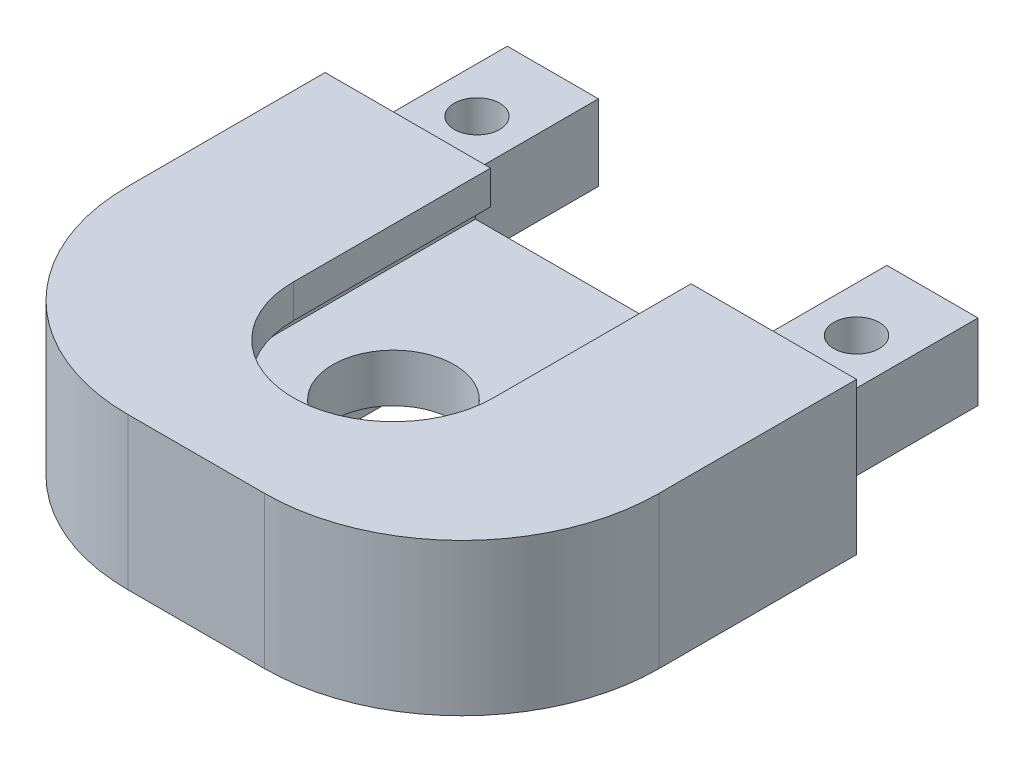
ISO-10303-21;
HEADER;
FILE_DESCRIPTION(('STEP AP214'),'2;1');
FILE_NAME('part.step','',(''),(''),'','','');
FILE_SCHEMA(('AUTOMOTIVE_DESIGN { 1 0 10303 214 1 1 1 1 }'));
ENDSEC;
DATA;
#1=APPLICATION_CONTEXT('core data for automotive mechanical design processes');
#2=APPLICATION_PROTOCOL_DEFINITION('international standard','automotive_design',2000,#1);
#3=PRODUCT_CONTEXT('',#1,'mechanical');
#4=PRODUCT('Part','Part','',(#3));
#5=PRODUCT_RELATED_PRODUCT_CATEGORY('part','',(#4));
#6=PRODUCT_DEFINITION_FORMATION('','',#4);
#7=PRODUCT_DEFINITION_CONTEXT('part definition',#1,'design');
#8=PRODUCT_DEFINITION('design','',#6,#7);
#9=PRODUCT_DEFINITION_SHAPE('','',#8);
#10=(LENGTH_UNIT() NAMED_UNIT(*) SI_UNIT(.MILLI.,.METRE.));
#11=(NAMED_UNIT(*) PLANE_ANGLE_UNIT() SI_UNIT($,.RADIAN.));
#12=(NAMED_UNIT(*) SI_UNIT($,.STERADIAN.) SOLID_ANGLE_UNIT());
#13=UNCERTAINTY_MEASURE_WITH_UNIT(LENGTH_MEASURE(1.E-05),#10,'distance_accuracy_value','');
#14=(GEOMETRIC_REPRESENTATION_CONTEXT(3) GLOBAL_UNCERTAINTY_ASSIGNED_CONTEXT((#13)) GLOBAL_UNIT_ASSIGNED_CONTEXT((#10,
#11,#12)) REPRESENTATION_CONTEXT('',''));
#15=CARTESIAN_POINT('',(0.,0.,0.));
#16=DIRECTION('',(0.,0.,1.));
#17=DIRECTION('',(1.,0.,0.));
#18=AXIS2_PLACEMENT_3D('',#15,#16,#17);
#19=CARTESIAN_POINT('',(6.,5.,10.));
#20=DIRECTION('',(0.,0.,1.));
#21=DIRECTION('',(1.,0.,0.));
#22=AXIS2_PLACEMENT_3D('',#19,#20,#21);
#23=PLANE('',#22);
#24=DIRECTION('',(0.,-1.,0.));
#25=VECTOR('',#24,1.);
#26=CARTESIAN_POINT('',(25.,5.,10.));
#27=LINE('',#26,#25);
#28=CARTESIAN_POINT('',(25.,5.,10.));
#29=VERTEX_POINT('',#28);
#30=CARTESIAN_POINT('',(25.,0.,10.));
#31=VERTEX_POINT('',#30);
#32=EDGE_CURVE('E425',#29,#31,#27,.T.);
#33=ORIENTED_EDGE('',*,*,#32,.T.);
#34=DIRECTION('',(1.,0.,0.));
#35=VECTOR('',#34,1.);
#36=CARTESIAN_POINT('',(-2.,0.,10.));
#37=LINE('',#36,#35);
#38=CARTESIAN_POINT('',(31.,0.,10.));
#39=VERTEX_POINT('',#38);
#40=EDGE_CURVE('E352',#31,#39,#37,.T.);
#41=ORIENTED_EDGE('',*,*,#40,.T.);
#42=DIRECTION('',(0.,-1.,0.));
#43=VECTOR('',#42,1.);
#44=CARTESIAN_POINT('',(31.,5.,10.));
#45=LINE('',#44,#43);
#46=CARTESIAN_POINT('',(31.,5.,10.));
#47=VERTEX_POINT('',#46);
#48=EDGE_CURVE('E434',#47,#39,#45,.T.);
#49=ORIENTED_EDGE('',*,*,#48,.F.);
#50=DIRECTION('',(-1.,0.,0.));
#51=VECTOR('',#50,1.);
#52=CARTESIAN_POINT('',(33.,5.,10.));
#53=LINE('',#52,#51);
#54=EDGE_CURVE('E369',#47,#29,#53,.T.);
#55=ORIENTED_EDGE('',*,*,#54,.T.);
#56=EDGE_LOOP('',(#33,#41,#49,#55));
#57=FACE_BOUND('',#56,.T.);
#58=CARTESIAN_POINT('',(0.,0.,10.));
#59=VERTEX_POINT('',#58);
#60=CARTESIAN_POINT('',(6.,0.,10.));
#61=VERTEX_POINT('',#60);
#62=EDGE_CURVE('E349',#59,#61,#37,.T.);
#63=ORIENTED_EDGE('',*,*,#62,.T.);
#64=DIRECTION('',(0.,-1.,0.));
#65=VECTOR('',#64,1.);
#66=CARTESIAN_POINT('',(6.,5.,10.));
#67=LINE('',#66,#65);
#68=CARTESIAN_POINT('',(6.,5.,10.));
#69=VERTEX_POINT('',#68);
#70=EDGE_CURVE('E422',#69,#61,#67,.T.);
#71=ORIENTED_EDGE('',*,*,#70,.F.);
#72=CARTESIAN_POINT('',(0.,5.,10.));
#73=VERTEX_POINT('',#72);
#74=EDGE_CURVE('E372',#69,#73,#53,.T.);
#75=ORIENTED_EDGE('',*,*,#74,.T.);
#76=DIRECTION('',(0.,-1.,0.));
#77=VECTOR('',#76,1.);
#78=CARTESIAN_POINT('',(0.,5.,10.));
#79=LINE('',#78,#77);
#80=EDGE_CURVE('E442',#73,#59,#79,.T.);
#81=ORIENTED_EDGE('',*,*,#80,.T.);
#82=EDGE_LOOP('',(#63,#71,#75,#81));
#83=FACE_BOUND('',#82,.T.);
#84=DIRECTION('',(1.,0.,0.));
#85=VECTOR('',#84,1.);
#86=CARTESIAN_POINT('',(6.,-0.287500000000004,10.));
#87=LINE('',#86,#85);
#88=CARTESIAN_POINT('',(7.9,-0.287500000000004,10.));
#89=VERTEX_POINT('',#88);
#90=CARTESIAN_POINT('',(8.9,-0.287500000000004,10.));
#91=VERTEX_POINT('',#90);
#92=EDGE_CURVE('E11',#89,#91,#87,.T.);
#93=ORIENTED_EDGE('',*,*,#92,.T.);
#94=DIRECTION('',(0.,-1.,0.));
#95=VECTOR('',#94,1.);
#96=CARTESIAN_POINT('',(8.9,5.,10.));
#97=LINE('',#96,#95);
#98=CARTESIAN_POINT('',(8.9,-2.5,10.));
#99=VERTEX_POINT('',#98);
#100=EDGE_CURVE('E305',#91,#99,#97,.T.);
#101=ORIENTED_EDGE('',*,*,#100,.T.);
#102=DIRECTION('',(-1.,0.,0.));
#103=VECTOR('',#102,1.);
#104=CARTESIAN_POINT('',(33.,-2.5,10.));
#105=LINE('',#104,#103);
#106=CARTESIAN_POINT('',(-2.,-2.5,10.));
#107=VERTEX_POINT('',#106);
#108=EDGE_CURVE('E359',#99,#107,#105,.T.);
#109=ORIENTED_EDGE('',*,*,#108,.T.);
#110=DIRECTION('',(0.,-1.,0.));
#111=VECTOR('',#110,1.);
#112=CARTESIAN_POINT('',(-2.,5.,10.));
#113=LINE('',#112,#111);
#114=CARTESIAN_POINT('',(-2.,7.5,10.));
#115=VERTEX_POINT('',#114);
#116=EDGE_CURVE('E439',#115,#107,#113,.T.);
#117=ORIENTED_EDGE('',*,*,#116,.F.);
#118=DIRECTION('',(1.,0.,0.));
#119=VECTOR('',#118,1.);
#120=CARTESIAN_POINT('',(-2.,7.5,10.));
#121=LINE('',#120,#119);
#122=CARTESIAN_POINT('',(8.9,7.5,10.));
#123=VERTEX_POINT('',#122);
#124=EDGE_CURVE('E364',#115,#123,#121,.T.);
#125=ORIENTED_EDGE('',*,*,#124,.T.);
#126=DIRECTION('',(0.,1.,0.));
#127=VECTOR('',#126,1.);
#128=CARTESIAN_POINT('',(8.9,5.,10.));
#129=LINE('',#128,#127);
#130=CARTESIAN_POINT('',(8.9,5.2875,10.));
#131=VERTEX_POINT('',#130);
#132=EDGE_CURVE('E344',#131,#123,#129,.T.);
#133=ORIENTED_EDGE('',*,*,#132,.F.);
#134=DIRECTION('',(1.,0.,0.));
#135=VECTOR('',#134,1.);
#136=CARTESIAN_POINT('',(6.,5.2875,10.));
#137=LINE('',#136,#135);
#138=CARTESIAN_POINT('',(7.9,5.2875,10.));
#139=VERTEX_POINT('',#138);
#140=EDGE_CURVE('E466',#139,#131,#137,.T.);
#141=ORIENTED_EDGE('',*,*,#140,.F.);
#142=DIRECTION('',(0.,1.,0.));
#143=VECTOR('',#142,1.);
#144=CARTESIAN_POINT('',(7.9,5.,10.));
#145=LINE('',#144,#143);
#146=CARTESIAN_POINT('',(7.9,4.0875,10.));
#147=VERTEX_POINT('',#146);
#148=EDGE_CURVE('E468',#147,#139,#145,.T.);
#149=ORIENTED_EDGE('',*,*,#148,.F.);
#150=DIRECTION('',(-1.,0.,0.));
#151=VECTOR('',#150,1.);
#152=CARTESIAN_POINT('',(6.,4.0875,10.));
#153=LINE('',#152,#151);
#154=CARTESIAN_POINT('',(23.1,4.0875,10.));
#155=VERTEX_POINT('',#154);
#156=EDGE_CURVE('E470',#155,#147,#153,.T.);
#157=ORIENTED_EDGE('',*,*,#156,.F.);
#158=DIRECTION('',(0.,-1.,0.));
#159=VECTOR('',#158,1.);
#160=CARTESIAN_POINT('',(23.1,5.,10.));
#161=LINE('',#160,#159);
#162=CARTESIAN_POINT('',(23.1,5.2875,10.));
#163=VERTEX_POINT('',#162);
#164=EDGE_CURVE('E264',#163,#155,#161,.T.);
#165=ORIENTED_EDGE('',*,*,#164,.F.);
#166=DIRECTION('',(1.,0.,0.));
#167=VECTOR('',#166,1.);
#168=CARTESIAN_POINT('',(6.,5.28749999999994,10.));
#169=LINE('',#168,#167);
#170=CARTESIAN_POINT('',(22.1,5.2875,10.));
#171=VERTEX_POINT('',#170);
#172=EDGE_CURVE('E260',#171,#163,#169,.T.);
#173=ORIENTED_EDGE('',*,*,#172,.F.);
#174=DIRECTION('',(0.,-1.,0.));
#175=VECTOR('',#174,1.);
#176=CARTESIAN_POINT('',(22.1,5.,10.));
#177=LINE('',#176,#175);
#178=CARTESIAN_POINT('',(22.1,7.5,10.));
#179=VERTEX_POINT('',#178);
#180=EDGE_CURVE('E346',#179,#171,#177,.T.);
#181=ORIENTED_EDGE('',*,*,#180,.F.);
#182=CARTESIAN_POINT('',(33.,7.5,10.));
#183=VERTEX_POINT('',#182);
#184=EDGE_CURVE('E368',#179,#183,#121,.T.);
#185=ORIENTED_EDGE('',*,*,#184,.T.);
#186=DIRECTION('',(0.,-1.,0.));
#187=VECTOR('',#186,1.);
#188=CARTESIAN_POINT('',(33.,5.,10.));
#189=LINE('',#188,#187);
#190=CARTESIAN_POINT('',(33.,-2.5,10.));
#191=VERTEX_POINT('',#190);
#192=EDGE_CURVE('E437',#183,#191,#189,.T.);
#193=ORIENTED_EDGE('',*,*,#192,.T.);
#194=CARTESIAN_POINT('',(22.1,-2.5,10.));
#195=VERTEX_POINT('',#194);
#196=EDGE_CURVE('E361',#191,#195,#105,.T.);
#197=ORIENTED_EDGE('',*,*,#196,.T.);
#198=DIRECTION('',(0.,1.,0.));
#199=VECTOR('',#198,1.);
#200=CARTESIAN_POINT('',(22.1,5.,10.));
#201=LINE('',#200,#199);
#202=CARTESIAN_POINT('',(22.1,-0.2875,10.));
#203=VERTEX_POINT('',#202);
#204=EDGE_CURVE('E259',#195,#203,#201,.T.);
#205=ORIENTED_EDGE('',*,*,#204,.T.);
#206=DIRECTION('',(1.,0.,0.));
#207=VECTOR('',#206,1.);
#208=CARTESIAN_POINT('',(5.99999999999998,-0.287499999999945,10.));
#209=LINE('',#208,#207);
#210=CARTESIAN_POINT('',(23.1,-0.287500000000004,10.));
#211=VERTEX_POINT('',#210);
#212=EDGE_CURVE('E262',#203,#211,#209,.T.);
#213=ORIENTED_EDGE('',*,*,#212,.T.);
#214=DIRECTION('',(0.,1.,0.));
#215=VECTOR('',#214,1.);
#216=CARTESIAN_POINT('',(23.1,5.,10.));
#217=LINE('',#216,#215);
#218=CARTESIAN_POINT('',(23.1,0.912499999999999,10.));
#219=VERTEX_POINT('',#218);
#220=EDGE_CURVE('E270',#211,#219,#217,.T.);
#221=ORIENTED_EDGE('',*,*,#220,.T.);
#222=DIRECTION('',(-1.,0.,0.));
#223=VECTOR('',#222,1.);
#224=CARTESIAN_POINT('',(6.,0.912499999999999,10.));
#225=LINE('',#224,#223);
#226=CARTESIAN_POINT('',(7.9,0.912499999999999,10.));
#227=VERTEX_POINT('',#226);
#228=EDGE_CURVE('E273',#219,#227,#225,.T.);
#229=ORIENTED_EDGE('',*,*,#228,.T.);
#230=DIRECTION('',(0.,-1.,0.));
#231=VECTOR('',#230,1.);
#232=CARTESIAN_POINT('',(7.9,5.,10.));
#233=LINE('',#232,#231);
#234=EDGE_CURVE('E42',#227,#89,#233,.T.);
#235=ORIENTED_EDGE('',*,*,#234,.T.);
#236=EDGE_LOOP('',(#93,#101,#109,#117,#125,#133,#141,#149,#157,#165,#173,#181,#185,#193,#197,
#205,#213,#221,#229,#235));
#237=FACE_BOUND('',#236,.T.);
#238=ADVANCED_FACE('F33',(#57,#83,#237),#23,.F.);
#239=CARTESIAN_POINT('',(-2.,7.5,-25.0891721190455));
#240=DIRECTION('',(0.,1.,0.));
#241=DIRECTION('',(0.,0.,1.));
#242=AXIS2_PLACEMENT_3D('',#239,#240,#241);
#243=PLANE('',#242);
#244=DIRECTION('',(0.,0.,1.));
#245=VECTOR('',#244,1.);
#246=CARTESIAN_POINT('',(22.1,7.5,-25.0891721190455));
#247=LINE('',#246,#245);
#248=CARTESIAN_POINT('',(22.1,7.5,23.));
#249=VERTEX_POINT('',#248);
#250=EDGE_CURVE('E463',#179,#249,#247,.T.);
#251=ORIENTED_EDGE('',*,*,#250,.T.);
#252=CARTESIAN_POINT('',(15.5,7.5,23.));
#253=DIRECTION('',(0.,1.,0.));
#254=DIRECTION('',(0.,0.,1.));
#255=AXIS2_PLACEMENT_3D('',#252,#253,#254);
#256=CIRCLE('',#255,6.6);
#257=CARTESIAN_POINT('',(8.9,7.5,23.));
#258=VERTEX_POINT('',#257);
#259=EDGE_CURVE('E307',#258,#249,#256,.T.);
#260=ORIENTED_EDGE('',*,*,#259,.F.);
#261=DIRECTION('',(0.,0.,-1.));
#262=VECTOR('',#261,1.);
#263=CARTESIAN_POINT('',(8.9,7.5,-25.0891721190455));
#264=LINE('',#263,#262);
#265=EDGE_CURVE('E460',#258,#123,#264,.T.);
#266=ORIENTED_EDGE('',*,*,#265,.T.);
#267=ORIENTED_EDGE('',*,*,#124,.F.);
#268=DIRECTION('',(0.,0.,1.));
#269=VECTOR('',#268,1.);
#270=CARTESIAN_POINT('',(-2.,7.5,-25.0891721190455));
#271=LINE('',#270,#269);
#272=CARTESIAN_POINT('',(-2.,7.5,23.));
#273=VERTEX_POINT('',#272);
#274=EDGE_CURVE('E375',#115,#273,#271,.T.);
#275=ORIENTED_EDGE('',*,*,#274,.T.);
#276=CARTESIAN_POINT('',(11.,7.5,23.));
#277=DIRECTION('',(0.,1.,0.));
#278=DIRECTION('',(0.,0.,1.));
#279=AXIS2_PLACEMENT_3D('',#276,#277,#278);
#280=CIRCLE('',#279,13.);
#281=CARTESIAN_POINT('',(11.,7.5,36.));
#282=VERTEX_POINT('',#281);
#283=EDGE_CURVE('E56',#273,#282,#280,.T.);
#284=ORIENTED_EDGE('',*,*,#283,.T.);
#285=DIRECTION('',(-1.,0.,0.));
#286=VECTOR('',#285,1.);
#287=CARTESIAN_POINT('',(-2.,7.5,36.));
#288=LINE('',#287,#286);
#289=CARTESIAN_POINT('',(20.,7.5,36.));
#290=VERTEX_POINT('',#289);
#291=EDGE_CURVE('E363',#290,#282,#288,.T.);
#292=ORIENTED_EDGE('',*,*,#291,.F.);
#293=CARTESIAN_POINT('',(20.,7.5,23.));
#294=DIRECTION('',(0.,1.,0.));
#295=DIRECTION('',(0.,0.,1.));
#296=AXIS2_PLACEMENT_3D('',#293,#294,#295);
#297=CIRCLE('',#296,13.);
#298=CARTESIAN_POINT('',(33.,7.5,23.));
#299=VERTEX_POINT('',#298);
#300=EDGE_CURVE('E457',#290,#299,#297,.T.);
#301=ORIENTED_EDGE('',*,*,#300,.T.);
#302=DIRECTION('',(0.,0.,1.));
#303=VECTOR('',#302,1.);
#304=CARTESIAN_POINT('',(33.,7.5,-25.0891721190455));
#305=LINE('',#304,#303);
#306=EDGE_CURVE('E374',#183,#299,#305,.T.);
#307=ORIENTED_EDGE('',*,*,#306,.F.);
#308=ORIENTED_EDGE('',*,*,#184,.F.);
#309=EDGE_LOOP('',(#251,#260,#266,#267,#275,#284,#292,#301,#307,#308));
#310=FACE_BOUND('',#309,.T.);
#311=ADVANCED_FACE('F509',(#310),#243,.T.);
#312=CARTESIAN_POINT('',(0.,0.,0.));
#313=DIRECTION('',(0.,-1.,0.));
#314=DIRECTION('',(0.,0.,-1.));
#315=AXIS2_PLACEMENT_3D('',#312,#313,#314);
#316=PLANE('',#315);
#317=ORIENTED_EDGE('',*,*,#62,.F.);
#318=DIRECTION('',(0.,0.,1.));
#319=VECTOR('',#318,1.);
#320=CARTESIAN_POINT('',(0.,0.,10.));
#321=LINE('',#320,#319);
#322=CARTESIAN_POINT('',(0.,0.,0.));
#323=VERTEX_POINT('',#322);
#324=EDGE_CURVE('E388',#323,#59,#321,.T.);
#325=ORIENTED_EDGE('',*,*,#324,.F.);
#326=DIRECTION('',(-1.,0.,0.));
#327=VECTOR('',#326,1.);
#328=CARTESIAN_POINT('',(0.,0.,0.));
#329=LINE('',#328,#327);
#330=CARTESIAN_POINT('',(6.,0.,0.));
#331=VERTEX_POINT('',#330);
#332=EDGE_CURVE('E394',#331,#323,#329,.T.);
#333=ORIENTED_EDGE('',*,*,#332,.F.);
#334=DIRECTION('',(0.,0.,-1.));
#335=VECTOR('',#334,1.);
#336=CARTESIAN_POINT('',(6.,0.,0.));
#337=LINE('',#336,#335);
#338=EDGE_CURVE('E414',#61,#331,#337,.T.);
#339=ORIENTED_EDGE('',*,*,#338,.F.);
#340=EDGE_LOOP('',(#317,#325,#333,#339));
#341=FACE_BOUND('',#340,.T.);
#342=CARTESIAN_POINT('',(3.,0.,5.));
#343=DIRECTION('',(0.,1.,0.));
#344=DIRECTION('',(0.,0.,1.));
#345=AXIS2_PLACEMENT_3D('',#342,#343,#344);
#346=CIRCLE('',#345,1.5);
#347=CARTESIAN_POINT('',(3.,0.,6.5));
#348=VERTEX_POINT('',#347);
#349=EDGE_CURVE('E382',#348,#348,#346,.T.);
#350=ORIENTED_EDGE('',*,*,#349,.T.);
#351=EDGE_LOOP('',(#350));
#352=FACE_BOUND('',#351,.T.);
#353=ADVANCED_FACE('F515',(#341,#352),#316,.T.);
#354=CARTESIAN_POINT('',(0.,5.,0.));
#355=DIRECTION('',(0.,-1.,0.));
#356=DIRECTION('',(0.,0.,-1.));
#357=AXIS2_PLACEMENT_3D('',#354,#355,#356);
#358=PLANE('',#357);
#359=CARTESIAN_POINT('',(28.,5.,5.));
#360=DIRECTION('',(0.,1.,0.));
#361=DIRECTION('',(0.,0.,-1.));
#362=AXIS2_PLACEMENT_3D('',#359,#360,#361);
#363=CIRCLE('',#362,1.5);
#364=CARTESIAN_POINT('',(28.,5.,3.5));
#365=VERTEX_POINT('',#364);
#366=EDGE_CURVE('E379',#365,#365,#363,.T.);
#367=ORIENTED_EDGE('',*,*,#366,.F.);
#368=EDGE_LOOP('',(#367));
#369=FACE_BOUND('',#368,.T.);
#370=ORIENTED_EDGE('',*,*,#54,.F.);
#371=DIRECTION('',(0.,0.,-1.));
#372=VECTOR('',#371,1.);
#373=CARTESIAN_POINT('',(31.,5.,0.));
#374=LINE('',#373,#372);
#375=CARTESIAN_POINT('',(31.,5.,0.));
#376=VERTEX_POINT('',#375);
#377=EDGE_CURVE('E393',#47,#376,#374,.T.);
#378=ORIENTED_EDGE('',*,*,#377,.T.);
#379=DIRECTION('',(-1.,0.,0.));
#380=VECTOR('',#379,1.);
#381=CARTESIAN_POINT('',(25.,5.,0.));
#382=LINE('',#381,#380);
#383=CARTESIAN_POINT('',(25.,5.,0.));
#384=VERTEX_POINT('',#383);
#385=EDGE_CURVE('E396',#376,#384,#382,.T.);
#386=ORIENTED_EDGE('',*,*,#385,.T.);
#387=DIRECTION('',(0.,0.,1.));
#388=VECTOR('',#387,1.);
#389=CARTESIAN_POINT('',(25.,5.,10.));
#390=LINE('',#389,#388);
#391=EDGE_CURVE('E398',#384,#29,#390,.T.);
#392=ORIENTED_EDGE('',*,*,#391,.T.);
#393=EDGE_LOOP('',(#370,#378,#386,#392));
#394=FACE_BOUND('',#393,.T.);
#395=ADVANCED_FACE('F759',(#369,#394),#358,.F.);
#396=CARTESIAN_POINT('',(3.,5.,5.));
#397=DIRECTION('',(0.,1.,0.));
#398=DIRECTION('',(0.,0.,1.));
#399=AXIS2_PLACEMENT_3D('',#396,#397,#398);
#400=CIRCLE('',#399,1.5);
#401=CARTESIAN_POINT('',(3.,5.,6.5));
#402=VERTEX_POINT('',#401);
#403=EDGE_CURVE('E385',#402,#402,#400,.T.);
#404=ORIENTED_EDGE('',*,*,#403,.F.);
#405=EDGE_LOOP('',(#404));
#406=FACE_BOUND('',#405,.T.);
#407=ORIENTED_EDGE('',*,*,#74,.F.);
#408=DIRECTION('',(0.,0.,-1.));
#409=VECTOR('',#408,1.);
#410=CARTESIAN_POINT('',(6.,5.,0.));
#411=LINE('',#410,#409);
#412=CARTESIAN_POINT('',(6.,5.,0.));
#413=VERTEX_POINT('',#412);
#414=EDGE_CURVE('E400',#69,#413,#411,.T.);
#415=ORIENTED_EDGE('',*,*,#414,.T.);
#416=DIRECTION('',(-1.,0.,0.));
#417=VECTOR('',#416,1.);
#418=CARTESIAN_POINT('',(0.,5.,0.));
#419=LINE('',#418,#417);
#420=CARTESIAN_POINT('',(0.,5.,0.));
#421=VERTEX_POINT('',#420);
#422=EDGE_CURVE('E402',#413,#421,#419,.T.);
#423=ORIENTED_EDGE('',*,*,#422,.T.);
#424=DIRECTION('',(0.,0.,1.));
#425=VECTOR('',#424,1.);
#426=CARTESIAN_POINT('',(0.,5.,10.));
#427=LINE('',#426,#425);
#428=EDGE_CURVE('E391',#421,#73,#427,.T.);
#429=ORIENTED_EDGE('',*,*,#428,.T.);
#430=EDGE_LOOP('',(#407,#415,#423,#429));
#431=FACE_BOUND('',#430,.T.);
#432=ADVANCED_FACE('F768',(#406,#431),#358,.F.);
#433=ORIENTED_EDGE('',*,*,#40,.F.);
#434=DIRECTION('',(0.,0.,1.));
#435=VECTOR('',#434,1.);
#436=CARTESIAN_POINT('',(25.,0.,10.));
#437=LINE('',#436,#435);
#438=CARTESIAN_POINT('',(25.,0.,0.));
#439=VERTEX_POINT('',#438);
#440=EDGE_CURVE('E411',#439,#31,#437,.T.);
#441=ORIENTED_EDGE('',*,*,#440,.F.);
#442=DIRECTION('',(-1.,0.,0.));
#443=VECTOR('',#442,1.);
#444=CARTESIAN_POINT('',(25.,0.,0.));
#445=LINE('',#444,#443);
#446=CARTESIAN_POINT('',(31.,0.,0.));
#447=VERTEX_POINT('',#446);
#448=EDGE_CURVE('E409',#447,#439,#445,.T.);
#449=ORIENTED_EDGE('',*,*,#448,.F.);
#450=DIRECTION('',(0.,0.,-1.));
#451=VECTOR('',#450,1.);
#452=CARTESIAN_POINT('',(31.,0.,0.));
#453=LINE('',#452,#451);
#454=EDGE_CURVE('E407',#39,#447,#453,.T.);
#455=ORIENTED_EDGE('',*,*,#454,.F.);
#456=EDGE_LOOP('',(#433,#441,#449,#455));
#457=FACE_BOUND('',#456,.T.);
#458=CARTESIAN_POINT('',(28.,0.,5.));
#459=DIRECTION('',(0.,1.,0.));
#460=DIRECTION('',(0.,0.,-1.));
#461=AXIS2_PLACEMENT_3D('',#458,#459,#460);
#462=CIRCLE('',#461,1.5);
#463=CARTESIAN_POINT('',(28.,0.,3.5));
#464=VERTEX_POINT('',#463);
#465=EDGE_CURVE('E367',#464,#464,#462,.T.);
#466=ORIENTED_EDGE('',*,*,#465,.T.);
#467=EDGE_LOOP('',(#466));
#468=FACE_BOUND('',#467,.T.);
#469=ADVANCED_FACE('F547',(#457,#468),#316,.T.);
#470=CARTESIAN_POINT('',(0.,5.,10.));
#471=DIRECTION('',(1.,0.,0.));
#472=DIRECTION('',(0.,0.,-1.));
#473=AXIS2_PLACEMENT_3D('',#470,#471,#472);
#474=PLANE('',#473);
#475=ORIENTED_EDGE('',*,*,#324,.T.);
#476=ORIENTED_EDGE('',*,*,#80,.F.);
#477=ORIENTED_EDGE('',*,*,#428,.F.);
#478=DIRECTION('',(0.,-1.,0.));
#479=VECTOR('',#478,1.);
#480=CARTESIAN_POINT('',(0.,5.,0.));
#481=LINE('',#480,#479);
#482=EDGE_CURVE('E404',#421,#323,#481,.T.);
#483=ORIENTED_EDGE('',*,*,#482,.T.);
#484=EDGE_LOOP('',(#475,#476,#477,#483));
#485=FACE_BOUND('',#484,.T.);
#486=ADVANCED_FACE('F545',(#485),#474,.F.);
#487=CARTESIAN_POINT('',(-2.,5.,36.));
#488=DIRECTION('',(1.,0.,0.));
#489=DIRECTION('',(0.,0.,-1.));
#490=AXIS2_PLACEMENT_3D('',#487,#488,#489);
#491=PLANE('',#490);
#492=DIRECTION('',(0.,0.,1.));
#493=VECTOR('',#492,1.);
#494=CARTESIAN_POINT('',(-2.,-2.5,-25.0891721190455));
#495=LINE('',#494,#493);
#496=CARTESIAN_POINT('',(-2.,-2.5,23.));
#497=VERTEX_POINT('',#496);
#498=EDGE_CURVE('E355',#107,#497,#495,.T.);
#499=ORIENTED_EDGE('',*,*,#498,.T.);
#500=DIRECTION('',(0.,-1.,0.));
#501=VECTOR('',#500,1.);
#502=CARTESIAN_POINT('',(-2.,5.,23.));
#503=LINE('',#502,#501);
#504=EDGE_CURVE('E49',#497,#273,#503,.F.);
#505=ORIENTED_EDGE('',*,*,#504,.T.);
#506=ORIENTED_EDGE('',*,*,#274,.F.);
#507=ORIENTED_EDGE('',*,*,#116,.T.);
#508=EDGE_LOOP('',(#499,#505,#506,#507));
#509=FACE_BOUND('',#508,.T.);
#510=ADVANCED_FACE('F541',(#509),#491,.F.);
#511=CARTESIAN_POINT('',(33.,5.,36.));
#512=DIRECTION('',(0.,0.,-1.));
#513=DIRECTION('',(-1.,0.,0.));
#514=AXIS2_PLACEMENT_3D('',#511,#512,#513);
#515=PLANE('',#514);
#516=DIRECTION('',(1.,0.,0.));
#517=VECTOR('',#516,1.);
#518=CARTESIAN_POINT('',(33.,-2.5,36.));
#519=LINE('',#518,#517);
#520=CARTESIAN_POINT('',(11.,-2.5,36.));
#521=VERTEX_POINT('',#520);
#522=CARTESIAN_POINT('',(20.,-2.5,36.));
#523=VERTEX_POINT('',#522);
#524=EDGE_CURVE('E348',#521,#523,#519,.T.);
#525=ORIENTED_EDGE('',*,*,#524,.T.);
#526=DIRECTION('',(0.,-1.,0.));
#527=VECTOR('',#526,1.);
#528=CARTESIAN_POINT('',(20.,5.,36.));
#529=LINE('',#528,#527);
#530=EDGE_CURVE('E454',#523,#290,#529,.F.);
#531=ORIENTED_EDGE('',*,*,#530,.T.);
#532=ORIENTED_EDGE('',*,*,#291,.T.);
#533=DIRECTION('',(0.,-1.,0.));
#534=VECTOR('',#533,1.);
#535=CARTESIAN_POINT('',(11.,5.,36.));
#536=LINE('',#535,#534);
#537=EDGE_CURVE('E451',#282,#521,#536,.T.);
#538=ORIENTED_EDGE('',*,*,#537,.T.);
#539=EDGE_LOOP('',(#525,#531,#532,#538));
#540=FACE_BOUND('',#539,.T.);
#541=ADVANCED_FACE('F537',(#540),#515,.F.);
#542=CARTESIAN_POINT('',(33.,5.,36.));
#543=DIRECTION('',(-1.,0.,0.));
#544=DIRECTION('',(0.,0.,1.));
#545=AXIS2_PLACEMENT_3D('',#542,#543,#544);
#546=PLANE('',#545);
#547=ORIENTED_EDGE('',*,*,#306,.T.);
#548=DIRECTION('',(0.,-1.,0.));
#549=VECTOR('',#548,1.);
#550=CARTESIAN_POINT('',(33.,5.,23.));
#551=LINE('',#550,#549);
#552=CARTESIAN_POINT('',(33.,-2.5,23.));
#553=VERTEX_POINT('',#552);
#554=EDGE_CURVE('E351',#299,#553,#551,.T.);
#555=ORIENTED_EDGE('',*,*,#554,.T.);
#556=DIRECTION('',(0.,0.,1.));
#557=VECTOR('',#556,1.);
#558=CARTESIAN_POINT('',(33.,-2.5,-25.0891721190455));
#559=LINE('',#558,#557);
#560=EDGE_CURVE('E356',#191,#553,#559,.T.);
#561=ORIENTED_EDGE('',*,*,#560,.F.);
#562=ORIENTED_EDGE('',*,*,#192,.F.);
#563=EDGE_LOOP('',(#547,#555,#561,#562));
#564=FACE_BOUND('',#563,.T.);
#565=ADVANCED_FACE('F533',(#564),#546,.F.);
#566=CARTESIAN_POINT('',(31.,5.,0.));
#567=DIRECTION('',(-1.,0.,0.));
#568=DIRECTION('',(0.,0.,1.));
#569=AXIS2_PLACEMENT_3D('',#566,#567,#568);
#570=PLANE('',#569);
#571=ORIENTED_EDGE('',*,*,#454,.T.);
#572=DIRECTION('',(0.,-1.,0.));
#573=VECTOR('',#572,1.);
#574=CARTESIAN_POINT('',(31.,5.,0.));
#575=LINE('',#574,#573);
#576=EDGE_CURVE('E431',#376,#447,#575,.T.);
#577=ORIENTED_EDGE('',*,*,#576,.F.);
#578=ORIENTED_EDGE('',*,*,#377,.F.);
#579=ORIENTED_EDGE('',*,*,#48,.T.);
#580=EDGE_LOOP('',(#571,#577,#578,#579));
#581=FACE_BOUND('',#580,.T.);
#582=ADVANCED_FACE('F529',(#581),#570,.F.);
#583=CARTESIAN_POINT('',(25.,5.,0.));
#584=DIRECTION('',(0.,0.,1.));
#585=DIRECTION('',(1.,0.,0.));
#586=AXIS2_PLACEMENT_3D('',#583,#584,#585);
#587=PLANE('',#586);
#588=ORIENTED_EDGE('',*,*,#448,.T.);
#589=DIRECTION('',(0.,-1.,0.));
#590=VECTOR('',#589,1.);
#591=CARTESIAN_POINT('',(25.,5.,0.));
#592=LINE('',#591,#590);
#593=EDGE_CURVE('E428',#384,#439,#592,.T.);
#594=ORIENTED_EDGE('',*,*,#593,.F.);
#595=ORIENTED_EDGE('',*,*,#385,.F.);
#596=ORIENTED_EDGE('',*,*,#576,.T.);
#597=EDGE_LOOP('',(#588,#594,#595,#596));
#598=FACE_BOUND('',#597,.T.);
#599=ADVANCED_FACE('F525',(#598),#587,.F.);
#600=CARTESIAN_POINT('',(25.,5.,10.));
#601=DIRECTION('',(1.,0.,0.));
#602=DIRECTION('',(0.,0.,-1.));
#603=AXIS2_PLACEMENT_3D('',#600,#601,#602);
#604=PLANE('',#603);
#605=ORIENTED_EDGE('',*,*,#440,.T.);
#606=ORIENTED_EDGE('',*,*,#32,.F.);
#607=ORIENTED_EDGE('',*,*,#391,.F.);
#608=ORIENTED_EDGE('',*,*,#593,.T.);
#609=EDGE_LOOP('',(#605,#606,#607,#608));
#610=FACE_BOUND('',#609,.T.);
#611=ADVANCED_FACE('F522',(#610),#604,.F.);
#612=CARTESIAN_POINT('',(6.,5.,0.));
#613=DIRECTION('',(-1.,0.,0.));
#614=DIRECTION('',(0.,0.,1.));
#615=AXIS2_PLACEMENT_3D('',#612,#613,#614);
#616=PLANE('',#615);
#617=ORIENTED_EDGE('',*,*,#338,.T.);
#618=DIRECTION('',(0.,-1.,0.));
#619=VECTOR('',#618,1.);
#620=CARTESIAN_POINT('',(6.,5.,0.));
#621=LINE('',#620,#619);
#622=EDGE_CURVE('E419',#413,#331,#621,.T.);
#623=ORIENTED_EDGE('',*,*,#622,.F.);
#624=ORIENTED_EDGE('',*,*,#414,.F.);
#625=ORIENTED_EDGE('',*,*,#70,.T.);
#626=EDGE_LOOP('',(#617,#623,#624,#625));
#627=FACE_BOUND('',#626,.T.);
#628=ADVANCED_FACE('F520',(#627),#616,.F.);
#629=CARTESIAN_POINT('',(0.,5.,0.));
#630=DIRECTION('',(0.,0.,1.));
#631=DIRECTION('',(1.,0.,0.));
#632=AXIS2_PLACEMENT_3D('',#629,#630,#631);
#633=PLANE('',#632);
#634=ORIENTED_EDGE('',*,*,#332,.T.);
#635=ORIENTED_EDGE('',*,*,#482,.F.);
#636=ORIENTED_EDGE('',*,*,#422,.F.);
#637=ORIENTED_EDGE('',*,*,#622,.T.);
#638=EDGE_LOOP('',(#634,#635,#636,#637));
#639=FACE_BOUND('',#638,.T.);
#640=ADVANCED_FACE('F817',(#639),#633,.F.);
#641=CARTESIAN_POINT('',(3.,5.,5.));
#642=DIRECTION('',(0.,-1.,0.));
#643=DIRECTION('',(0.,0.,-1.));
#644=AXIS2_PLACEMENT_3D('',#641,#642,#643);
#645=CYLINDRICAL_SURFACE('',#644,1.5);
#646=ORIENTED_EDGE('',*,*,#403,.T.);
#647=EDGE_LOOP('',(#646));
#648=FACE_BOUND('',#647,.T.);
#649=ORIENTED_EDGE('',*,*,#349,.F.);
#650=EDGE_LOOP('',(#649));
#651=FACE_BOUND('',#650,.T.);
#652=ADVANCED_FACE('F823',(#648,#651),#645,.F.);
#653=CARTESIAN_POINT('',(28.,5.,5.));
#654=DIRECTION('',(0.,-1.,0.));
#655=DIRECTION('',(0.,0.,-1.));
#656=AXIS2_PLACEMENT_3D('',#653,#654,#655);
#657=CYLINDRICAL_SURFACE('',#656,1.5);
#658=ORIENTED_EDGE('',*,*,#366,.T.);
#659=EDGE_LOOP('',(#658));
#660=FACE_BOUND('',#659,.T.);
#661=ORIENTED_EDGE('',*,*,#465,.F.);
#662=EDGE_LOOP('',(#661));
#663=FACE_BOUND('',#662,.T.);
#664=ADVANCED_FACE('F557',(#660,#663),#657,.F.);
#665=CARTESIAN_POINT('',(33.,-2.5,-25.0891721190455));
#666=DIRECTION('',(0.,-1.,0.));
#667=DIRECTION('',(0.,0.,-1.));
#668=AXIS2_PLACEMENT_3D('',#665,#666,#667);
#669=PLANE('',#668);
#670=DIRECTION('',(0.,0.,-1.));
#671=VECTOR('',#670,1.);
#672=CARTESIAN_POINT('',(8.9,-2.5,-25.0891721190455));
#673=LINE('',#672,#671);
#674=CARTESIAN_POINT('',(8.9,-2.5,23.));
#675=VERTEX_POINT('',#674);
#676=EDGE_CURVE('E255',#675,#99,#673,.T.);
#677=ORIENTED_EDGE('',*,*,#676,.F.);
#678=CARTESIAN_POINT('',(15.5,-2.5,23.));
#679=DIRECTION('',(0.,-1.,0.));
#680=DIRECTION('',(0.,0.,-1.));
#681=AXIS2_PLACEMENT_3D('',#678,#679,#680);
#682=CIRCLE('',#681,6.6);
#683=CARTESIAN_POINT('',(22.1,-2.5,23.));
#684=VERTEX_POINT('',#683);
#685=EDGE_CURVE('E236',#684,#675,#682,.T.);
#686=ORIENTED_EDGE('',*,*,#685,.F.);
#687=DIRECTION('',(0.,0.,1.));
#688=VECTOR('',#687,1.);
#689=CARTESIAN_POINT('',(22.1,-2.5,-25.0891721190455));
#690=LINE('',#689,#688);
#691=EDGE_CURVE('E252',#195,#684,#690,.T.);
#692=ORIENTED_EDGE('',*,*,#691,.F.);
#693=ORIENTED_EDGE('',*,*,#196,.F.);
#694=ORIENTED_EDGE('',*,*,#560,.T.);
#695=CARTESIAN_POINT('',(20.,-2.5,23.));
#696=DIRECTION('',(0.,-1.,0.));
#697=DIRECTION('',(0.,0.,-1.));
#698=AXIS2_PLACEMENT_3D('',#695,#696,#697);
#699=CIRCLE('',#698,13.);
#700=EDGE_CURVE('E449',#553,#523,#699,.T.);
#701=ORIENTED_EDGE('',*,*,#700,.T.);
#702=ORIENTED_EDGE('',*,*,#524,.F.);
#703=CARTESIAN_POINT('',(11.,-2.5,23.));
#704=DIRECTION('',(0.,-1.,0.));
#705=DIRECTION('',(0.,0.,-1.));
#706=AXIS2_PLACEMENT_3D('',#703,#704,#705);
#707=CIRCLE('',#706,13.);
#708=EDGE_CURVE('E447',#521,#497,#707,.T.);
#709=ORIENTED_EDGE('',*,*,#708,.T.);
#710=ORIENTED_EDGE('',*,*,#498,.F.);
#711=ORIENTED_EDGE('',*,*,#108,.F.);
#712=EDGE_LOOP('',(#677,#686,#692,#693,#694,#701,#702,#709,#710,#711));
#713=FACE_BOUND('',#712,.T.);
#714=ADVANCED_FACE('F250',(#713),#669,.T.);
#715=CARTESIAN_POINT('',(20.,5.,23.));
#716=DIRECTION('',(0.,-1.,0.));
#717=DIRECTION('',(0.,0.,-1.));
#718=AXIS2_PLACEMENT_3D('',#715,#716,#717);
#719=CYLINDRICAL_SURFACE('',#718,13.);
#720=ORIENTED_EDGE('',*,*,#300,.F.);
#721=ORIENTED_EDGE('',*,*,#530,.F.);
#722=ORIENTED_EDGE('',*,*,#700,.F.);
#723=ORIENTED_EDGE('',*,*,#554,.F.);
#724=EDGE_LOOP('',(#720,#721,#722,#723));
#725=FACE_BOUND('',#724,.T.);
#726=ADVANCED_FACE('F549',(#725),#719,.T.);
#727=CARTESIAN_POINT('',(11.,5.,23.));
#728=DIRECTION('',(0.,-1.,0.));
#729=DIRECTION('',(0.,0.,-1.));
#730=AXIS2_PLACEMENT_3D('',#727,#728,#729);
#731=CYLINDRICAL_SURFACE('',#730,13.);
#732=ORIENTED_EDGE('',*,*,#283,.F.);
#733=ORIENTED_EDGE('',*,*,#504,.F.);
#734=ORIENTED_EDGE('',*,*,#708,.F.);
#735=ORIENTED_EDGE('',*,*,#537,.F.);
#736=EDGE_LOOP('',(#732,#733,#734,#735));
#737=FACE_BOUND('',#736,.T.);
#738=ADVANCED_FACE('F35',(#737),#731,.T.);
#739=CARTESIAN_POINT('',(22.1,5.2875,0.));
#740=DIRECTION('',(0.,-1.,0.));
#741=DIRECTION('',(1.,0.,0.));
#742=AXIS2_PLACEMENT_3D('',#739,#740,#741);
#743=PLANE('',#742);
#744=DIRECTION('',(0.,0.,1.));
#745=VECTOR('',#744,1.);
#746=CARTESIAN_POINT('',(8.9,5.2875,0.));
#747=LINE('',#746,#745);
#748=CARTESIAN_POINT('',(8.9,5.2875,23.));
#749=VERTEX_POINT('',#748);
#750=EDGE_CURVE('E326',#131,#749,#747,.T.);
#751=ORIENTED_EDGE('',*,*,#750,.T.);
#752=CARTESIAN_POINT('',(15.5,5.28749999999998,23.));
#753=DIRECTION('',(0.,-1.,0.));
#754=DIRECTION('',(1.,0.,0.));
#755=AXIS2_PLACEMENT_3D('',#752,#753,#754);
#756=CIRCLE('',#755,6.6);
#757=CARTESIAN_POINT('',(22.1,5.2875,23.));
#758=VERTEX_POINT('',#757);
#759=EDGE_CURVE('E309',#749,#758,#756,.F.);
#760=ORIENTED_EDGE('',*,*,#759,.T.);
#761=DIRECTION('',(0.,0.,1.));
#762=VECTOR('',#761,1.);
#763=CARTESIAN_POINT('',(22.1,5.2875,0.));
#764=LINE('',#763,#762);
#765=EDGE_CURVE('E341',#171,#758,#764,.T.);
#766=ORIENTED_EDGE('',*,*,#765,.F.);
#767=ORIENTED_EDGE('',*,*,#172,.T.);
#768=DIRECTION('',(0.,0.,1.));
#769=VECTOR('',#768,1.);
#770=CARTESIAN_POINT('',(23.1,5.2875,0.));
#771=LINE('',#770,#769);
#772=CARTESIAN_POINT('',(23.1,5.2875,23.));
#773=VERTEX_POINT('',#772);
#774=EDGE_CURVE('E338',#163,#773,#771,.T.);
#775=ORIENTED_EDGE('',*,*,#774,.T.);
#776=CARTESIAN_POINT('',(15.5,5.2875,23.));
#777=DIRECTION('',(0.,-1.,0.));
#778=DIRECTION('',(0.,0.,-1.));
#779=AXIS2_PLACEMENT_3D('',#776,#777,#778);
#780=CIRCLE('',#779,7.6);
#781=CARTESIAN_POINT('',(7.9,5.2875,23.));
#782=VERTEX_POINT('',#781);
#783=EDGE_CURVE('E315',#773,#782,#780,.T.);
#784=ORIENTED_EDGE('',*,*,#783,.T.);
#785=DIRECTION('',(0.,0.,1.));
#786=VECTOR('',#785,1.);
#787=CARTESIAN_POINT('',(7.9,5.2875,0.));
#788=LINE('',#787,#786);
#789=EDGE_CURVE('E329',#139,#782,#788,.T.);
#790=ORIENTED_EDGE('',*,*,#789,.F.);
#791=ORIENTED_EDGE('',*,*,#140,.T.);
#792=EDGE_LOOP('',(#751,#760,#766,#767,#775,#784,#790,#791));
#793=FACE_BOUND('',#792,.T.);
#794=ADVANCED_FACE('F490',(#793),#743,.T.);
#795=CARTESIAN_POINT('',(23.1,5.2875,0.));
#796=DIRECTION('',(-1.,0.,0.));
#797=DIRECTION('',(0.,0.,1.));
#798=AXIS2_PLACEMENT_3D('',#795,#796,#797);
#799=PLANE('',#798);
#800=ORIENTED_EDGE('',*,*,#164,.T.);
#801=DIRECTION('',(0.,0.,1.));
#802=VECTOR('',#801,1.);
#803=CARTESIAN_POINT('',(23.1,4.0875,0.));
#804=LINE('',#803,#802);
#805=CARTESIAN_POINT('',(23.1,4.0875,23.));
#806=VERTEX_POINT('',#805);
#807=EDGE_CURVE('E335',#155,#806,#804,.T.);
#808=ORIENTED_EDGE('',*,*,#807,.T.);
#809=DIRECTION('',(0.,-1.,0.));
#810=VECTOR('',#809,1.);
#811=CARTESIAN_POINT('',(23.1,5.2875,23.));
#812=LINE('',#811,#810);
#813=EDGE_CURVE('E319',#773,#806,#812,.T.);
#814=ORIENTED_EDGE('',*,*,#813,.F.);
#815=ORIENTED_EDGE('',*,*,#774,.F.);
#816=EDGE_LOOP('',(#800,#808,#814,#815));
#817=FACE_BOUND('',#816,.T.);
#818=ADVANCED_FACE('F475',(#817),#799,.T.);
#819=CARTESIAN_POINT('',(15.5,4.0875,0.));
#820=DIRECTION('',(0.,1.,0.));
#821=DIRECTION('',(0.,0.,1.));
#822=AXIS2_PLACEMENT_3D('',#819,#820,#821);
#823=PLANE('',#822);
#824=CARTESIAN_POINT('',(15.5,4.0875,23.));
#825=DIRECTION('',(0.,1.,0.));
#826=DIRECTION('',(0.,0.,1.));
#827=AXIS2_PLACEMENT_3D('',#824,#825,#826);
#828=CIRCLE('',#827,4.);
#829=CARTESIAN_POINT('',(15.5,4.0875,27.));
#830=VERTEX_POINT('',#829);
#831=EDGE_CURVE('E675',#830,#830,#828,.T.);
#832=ORIENTED_EDGE('',*,*,#831,.F.);
#833=EDGE_LOOP('',(#832));
#834=FACE_BOUND('',#833,.T.);
#835=DIRECTION('',(0.,0.,1.));
#836=VECTOR('',#835,1.);
#837=CARTESIAN_POINT('',(7.9,4.0875,0.));
#838=LINE('',#837,#836);
#839=CARTESIAN_POINT('',(7.89999999999999,4.0875,23.));
#840=VERTEX_POINT('',#839);
#841=EDGE_CURVE('E332',#147,#840,#838,.T.);
#842=ORIENTED_EDGE('',*,*,#841,.T.);
#843=CARTESIAN_POINT('',(15.5,4.0875,23.));
#844=DIRECTION('',(0.,1.,0.));
#845=DIRECTION('',(0.,0.,1.));
#846=AXIS2_PLACEMENT_3D('',#843,#844,#845);
#847=CIRCLE('',#846,7.6);
#848=EDGE_CURVE('E312',#840,#806,#847,.T.);
#849=ORIENTED_EDGE('',*,*,#848,.T.);
#850=ORIENTED_EDGE('',*,*,#807,.F.);
#851=ORIENTED_EDGE('',*,*,#156,.T.);
#852=EDGE_LOOP('',(#842,#849,#850,#851));
#853=FACE_BOUND('',#852,.T.);
#854=ADVANCED_FACE('F480',(#834,#853),#823,.T.);
#855=CARTESIAN_POINT('',(7.9,4.0875,0.));
#856=DIRECTION('',(1.,0.,0.));
#857=DIRECTION('',(0.,0.,-1.));
#858=AXIS2_PLACEMENT_3D('',#855,#856,#857);
#859=PLANE('',#858);
#860=ORIENTED_EDGE('',*,*,#148,.T.);
#861=ORIENTED_EDGE('',*,*,#789,.T.);
#862=DIRECTION('',(0.,1.,0.));
#863=VECTOR('',#862,1.);
#864=CARTESIAN_POINT('',(7.9,4.0875,23.));
#865=LINE('',#864,#863);
#866=EDGE_CURVE('E321',#840,#782,#865,.T.);
#867=ORIENTED_EDGE('',*,*,#866,.F.);
#868=ORIENTED_EDGE('',*,*,#841,.F.);
#869=EDGE_LOOP('',(#860,#861,#867,#868));
#870=FACE_BOUND('',#869,.T.);
#871=ADVANCED_FACE('F487',(#870),#859,.T.);
#872=CARTESIAN_POINT('',(22.1,7.5,0.));
#873=DIRECTION('',(-1.,0.,0.));
#874=DIRECTION('',(0.,0.,1.));
#875=AXIS2_PLACEMENT_3D('',#872,#873,#874);
#876=PLANE('',#875);
#877=ORIENTED_EDGE('',*,*,#180,.T.);
#878=ORIENTED_EDGE('',*,*,#765,.T.);
#879=DIRECTION('',(0.,-1.,0.));
#880=VECTOR('',#879,1.);
#881=CARTESIAN_POINT('',(22.1,7.5,23.));
#882=LINE('',#881,#880);
#883=EDGE_CURVE('E317',#249,#758,#882,.T.);
#884=ORIENTED_EDGE('',*,*,#883,.F.);
#885=ORIENTED_EDGE('',*,*,#250,.F.);
#886=EDGE_LOOP('',(#877,#878,#884,#885));
#887=FACE_BOUND('',#886,.T.);
#888=ADVANCED_FACE('F505',(#887),#876,.T.);
#889=CARTESIAN_POINT('',(8.9,5.2875,0.));
#890=DIRECTION('',(1.,0.,0.));
#891=DIRECTION('',(0.,0.,-1.));
#892=AXIS2_PLACEMENT_3D('',#889,#890,#891);
#893=PLANE('',#892);
#894=ORIENTED_EDGE('',*,*,#132,.T.);
#895=ORIENTED_EDGE('',*,*,#265,.F.);
#896=DIRECTION('',(0.,1.,0.));
#897=VECTOR('',#896,1.);
#898=CARTESIAN_POINT('',(8.9,5.2875,23.));
#899=LINE('',#898,#897);
#900=EDGE_CURVE('E324',#749,#258,#899,.T.);
#901=ORIENTED_EDGE('',*,*,#900,.F.);
#902=ORIENTED_EDGE('',*,*,#750,.F.);
#903=EDGE_LOOP('',(#894,#895,#901,#902));
#904=FACE_BOUND('',#903,.T.);
#905=ADVANCED_FACE('F496',(#904),#893,.T.);
#906=CARTESIAN_POINT('',(15.5,26.7835461480711,23.));
#907=DIRECTION('',(0.,-1.,0.));
#908=DIRECTION('',(0.,0.,-1.));
#909=AXIS2_PLACEMENT_3D('',#906,#907,#908);
#910=CYLINDRICAL_SURFACE('',#909,7.6);
#911=ORIENTED_EDGE('',*,*,#848,.F.);
#912=ORIENTED_EDGE('',*,*,#866,.T.);
#913=ORIENTED_EDGE('',*,*,#783,.F.);
#914=ORIENTED_EDGE('',*,*,#813,.T.);
#915=EDGE_LOOP('',(#911,#912,#913,#914));
#916=FACE_BOUND('',#915,.T.);
#917=ADVANCED_FACE('F493',(#916),#910,.F.);
#918=CARTESIAN_POINT('',(15.5,7.5,23.));
#919=DIRECTION('',(0.,-1.,0.));
#920=DIRECTION('',(0.,0.,-1.));
#921=AXIS2_PLACEMENT_3D('',#918,#919,#920);
#922=CYLINDRICAL_SURFACE('',#921,6.6);
#923=ORIENTED_EDGE('',*,*,#759,.F.);
#924=ORIENTED_EDGE('',*,*,#900,.T.);
#925=ORIENTED_EDGE('',*,*,#259,.T.);
#926=ORIENTED_EDGE('',*,*,#883,.T.);
#927=EDGE_LOOP('',(#923,#924,#925,#926));
#928=FACE_BOUND('',#927,.T.);
#929=ADVANCED_FACE('F495',(#928),#922,.F.);
#930=CARTESIAN_POINT('',(7.9,-0.287500000000004,0.));
#931=DIRECTION('',(0.,-1.,0.));
#932=DIRECTION('',(0.,0.,-1.));
#933=AXIS2_PLACEMENT_3D('',#930,#931,#932);
#934=PLANE('',#933);
#935=CARTESIAN_POINT('',(15.5,-0.287500000000004,23.));
#936=DIRECTION('',(0.,-1.,0.));
#937=DIRECTION('',(0.,0.,-1.));
#938=AXIS2_PLACEMENT_3D('',#935,#936,#937);
#939=CIRCLE('',#938,6.6);
#940=CARTESIAN_POINT('',(8.9,-0.287500000000004,23.));
#941=VERTEX_POINT('',#940);
#942=CARTESIAN_POINT('',(22.1,-0.287500000000004,23.));
#943=VERTEX_POINT('',#942);
#944=EDGE_CURVE('E239',#941,#943,#939,.F.);
#945=ORIENTED_EDGE('',*,*,#944,.F.);
#946=DIRECTION('',(0.,0.,1.));
#947=VECTOR('',#946,1.);
#948=CARTESIAN_POINT('',(8.9,-0.287500000000004,0.));
#949=LINE('',#948,#947);
#950=EDGE_CURVE('E296',#91,#941,#949,.T.);
#951=ORIENTED_EDGE('',*,*,#950,.F.);
#952=ORIENTED_EDGE('',*,*,#92,.F.);
#953=DIRECTION('',(0.,0.,1.));
#954=VECTOR('',#953,1.);
#955=CARTESIAN_POINT('',(7.9,-0.287500000000004,0.));
#956=LINE('',#955,#954);
#957=CARTESIAN_POINT('',(7.89999999999999,-0.287500000000003,23.));
#958=VERTEX_POINT('',#957);
#959=EDGE_CURVE('E287',#89,#958,#956,.T.);
#960=ORIENTED_EDGE('',*,*,#959,.T.);
#961=CARTESIAN_POINT('',(15.5,-0.287500000000003,23.));
#962=DIRECTION('',(0.,-1.,0.));
#963=DIRECTION('',(0.,0.,-1.));
#964=AXIS2_PLACEMENT_3D('',#961,#962,#963);
#965=CIRCLE('',#964,7.6);
#966=CARTESIAN_POINT('',(23.1,-0.287500000000003,23.));
#967=VERTEX_POINT('',#966);
#968=EDGE_CURVE('E582',#967,#958,#965,.T.);
#969=ORIENTED_EDGE('',*,*,#968,.F.);
#970=DIRECTION('',(0.,0.,1.));
#971=VECTOR('',#970,1.);
#972=CARTESIAN_POINT('',(23.1,-0.287500000000004,0.));
#973=LINE('',#972,#971);
#974=EDGE_CURVE('E298',#211,#967,#973,.T.);
#975=ORIENTED_EDGE('',*,*,#974,.F.);
#976=ORIENTED_EDGE('',*,*,#212,.F.);
#977=DIRECTION('',(0.,0.,1.));
#978=VECTOR('',#977,1.);
#979=CARTESIAN_POINT('',(22.1,-0.2875,0.));
#980=LINE('',#979,#978);
#981=EDGE_CURVE('E244',#203,#943,#980,.T.);
#982=ORIENTED_EDGE('',*,*,#981,.T.);
#983=EDGE_LOOP('',(#945,#951,#952,#960,#969,#975,#976,#982));
#984=FACE_BOUND('',#983,.T.);
#985=ADVANCED_FACE('F502',(#984),#934,.F.);
#986=CARTESIAN_POINT('',(7.9,0.912499999999999,0.));
#987=DIRECTION('',(-1.,0.,0.));
#988=DIRECTION('',(0.,0.,1.));
#989=AXIS2_PLACEMENT_3D('',#986,#987,#988);
#990=PLANE('',#989);
#991=DIRECTION('',(0.,0.,1.));
#992=VECTOR('',#991,1.);
#993=CARTESIAN_POINT('',(7.9,0.912499999999999,0.));
#994=LINE('',#993,#992);
#995=CARTESIAN_POINT('',(7.89999999999999,0.912499999999999,23.));
#996=VERTEX_POINT('',#995);
#997=EDGE_CURVE('E285',#227,#996,#994,.T.);
#998=ORIENTED_EDGE('',*,*,#997,.T.);
#999=DIRECTION('',(0.,-1.,0.));
#1000=VECTOR('',#999,1.);
#1001=CARTESIAN_POINT('',(7.9,0.912499999999999,23.));
#1002=LINE('',#1001,#1000);
#1003=EDGE_CURVE('E589',#996,#958,#1002,.T.);
#1004=ORIENTED_EDGE('',*,*,#1003,.T.);
#1005=ORIENTED_EDGE('',*,*,#959,.F.);
#1006=ORIENTED_EDGE('',*,*,#234,.F.);
#1007=EDGE_LOOP('',(#998,#1004,#1005,#1006));
#1008=FACE_BOUND('',#1007,.T.);
#1009=ADVANCED_FACE('F283',(#1008),#990,.F.);
#1010=CARTESIAN_POINT('',(23.1,0.912499999999999,0.));
#1011=DIRECTION('',(0.,1.,0.));
#1012=DIRECTION('',(0.,0.,1.));
#1013=AXIS2_PLACEMENT_3D('',#1010,#1011,#1012);
#1014=PLANE('',#1013);
#1015=CARTESIAN_POINT('',(15.5,0.912499999999999,23.));
#1016=DIRECTION('',(0.,1.,0.));
#1017=DIRECTION('',(0.,0.,1.));
#1018=AXIS2_PLACEMENT_3D('',#1015,#1016,#1017);
#1019=CIRCLE('',#1018,4.);
#1020=CARTESIAN_POINT('',(15.5,0.912499999999999,27.));
#1021=VERTEX_POINT('',#1020);
#1022=EDGE_CURVE('E37',#1021,#1021,#1019,.T.);
#1023=ORIENTED_EDGE('',*,*,#1022,.T.);
#1024=EDGE_LOOP('',(#1023));
#1025=FACE_BOUND('',#1024,.T.);
#1026=DIRECTION('',(0.,0.,1.));
#1027=VECTOR('',#1026,1.);
#1028=CARTESIAN_POINT('',(23.1,0.912499999999999,0.));
#1029=LINE('',#1028,#1027);
#1030=CARTESIAN_POINT('',(23.1,0.912499999999999,23.));
#1031=VERTEX_POINT('',#1030);
#1032=EDGE_CURVE('E294',#219,#1031,#1029,.T.);
#1033=ORIENTED_EDGE('',*,*,#1032,.T.);
#1034=CARTESIAN_POINT('',(15.5,0.912499999999999,23.));
#1035=DIRECTION('',(0.,-1.,0.));
#1036=DIRECTION('',(0.,0.,-1.));
#1037=AXIS2_PLACEMENT_3D('',#1034,#1035,#1036);
#1038=CIRCLE('',#1037,7.6);
#1039=EDGE_CURVE('E293',#1031,#996,#1038,.T.);
#1040=ORIENTED_EDGE('',*,*,#1039,.T.);
#1041=ORIENTED_EDGE('',*,*,#997,.F.);
#1042=ORIENTED_EDGE('',*,*,#228,.F.);
#1043=EDGE_LOOP('',(#1033,#1040,#1041,#1042));
#1044=FACE_BOUND('',#1043,.T.);
#1045=ADVANCED_FACE('F291',(#1025,#1044),#1014,.F.);
#1046=CARTESIAN_POINT('',(23.1,-0.287500000000004,0.));
#1047=DIRECTION('',(1.,0.,0.));
#1048=DIRECTION('',(0.,0.,-1.));
#1049=AXIS2_PLACEMENT_3D('',#1046,#1047,#1048);
#1050=PLANE('',#1049);
#1051=ORIENTED_EDGE('',*,*,#974,.T.);
#1052=DIRECTION('',(0.,1.,0.));
#1053=VECTOR('',#1052,1.);
#1054=CARTESIAN_POINT('',(23.1,-0.287500000000004,23.));
#1055=LINE('',#1054,#1053);
#1056=EDGE_CURVE('E245',#967,#1031,#1055,.T.);
#1057=ORIENTED_EDGE('',*,*,#1056,.T.);
#1058=ORIENTED_EDGE('',*,*,#1032,.F.);
#1059=ORIENTED_EDGE('',*,*,#220,.F.);
#1060=EDGE_LOOP('',(#1051,#1057,#1058,#1059));
#1061=FACE_BOUND('',#1060,.T.);
#1062=ADVANCED_FACE('F596',(#1061),#1050,.F.);
#1063=CARTESIAN_POINT('',(8.9,-0.287500000000004,0.));
#1064=DIRECTION('',(-1.,0.,0.));
#1065=DIRECTION('',(0.,0.,1.));
#1066=AXIS2_PLACEMENT_3D('',#1063,#1064,#1065);
#1067=PLANE('',#1066);
#1068=ORIENTED_EDGE('',*,*,#950,.T.);
#1069=DIRECTION('',(0.,-1.,0.));
#1070=VECTOR('',#1069,1.);
#1071=CARTESIAN_POINT('',(8.9,-0.287500000000004,23.));
#1072=LINE('',#1071,#1070);
#1073=EDGE_CURVE('E587',#941,#675,#1072,.T.);
#1074=ORIENTED_EDGE('',*,*,#1073,.T.);
#1075=ORIENTED_EDGE('',*,*,#676,.T.);
#1076=ORIENTED_EDGE('',*,*,#100,.F.);
#1077=EDGE_LOOP('',(#1068,#1074,#1075,#1076));
#1078=FACE_BOUND('',#1077,.T.);
#1079=ADVANCED_FACE('F579',(#1078),#1067,.F.);
#1080=CARTESIAN_POINT('',(22.1,-2.5,0.));
#1081=DIRECTION('',(1.,0.,0.));
#1082=DIRECTION('',(0.,0.,-1.));
#1083=AXIS2_PLACEMENT_3D('',#1080,#1081,#1082);
#1084=PLANE('',#1083);
#1085=ORIENTED_EDGE('',*,*,#691,.T.);
#1086=DIRECTION('',(0.,1.,0.));
#1087=VECTOR('',#1086,1.);
#1088=CARTESIAN_POINT('',(22.1,-2.5,23.));
#1089=LINE('',#1088,#1087);
#1090=EDGE_CURVE('E233',#684,#943,#1089,.T.);
#1091=ORIENTED_EDGE('',*,*,#1090,.T.);
#1092=ORIENTED_EDGE('',*,*,#981,.F.);
#1093=ORIENTED_EDGE('',*,*,#204,.F.);
#1094=EDGE_LOOP('',(#1085,#1091,#1092,#1093));
#1095=FACE_BOUND('',#1094,.T.);
#1096=ADVANCED_FACE('F257',(#1095),#1084,.F.);
#1097=CARTESIAN_POINT('',(15.5,-21.7835461480711,23.));
#1098=DIRECTION('',(0.,1.,0.));
#1099=DIRECTION('',(0.,0.,1.));
#1100=AXIS2_PLACEMENT_3D('',#1097,#1098,#1099);
#1101=CYLINDRICAL_SURFACE('',#1100,7.6);
#1102=ORIENTED_EDGE('',*,*,#1039,.F.);
#1103=ORIENTED_EDGE('',*,*,#1056,.F.);
#1104=ORIENTED_EDGE('',*,*,#968,.T.);
#1105=ORIENTED_EDGE('',*,*,#1003,.F.);
#1106=EDGE_LOOP('',(#1102,#1103,#1104,#1105));
#1107=FACE_BOUND('',#1106,.T.);
#1108=ADVANCED_FACE('F599',(#1107),#1101,.F.);
#1109=CARTESIAN_POINT('',(15.5,-2.5,23.));
#1110=DIRECTION('',(0.,1.,0.));
#1111=DIRECTION('',(0.,0.,1.));
#1112=AXIS2_PLACEMENT_3D('',#1109,#1110,#1111);
#1113=CYLINDRICAL_SURFACE('',#1112,6.6);
#1114=ORIENTED_EDGE('',*,*,#944,.T.);
#1115=ORIENTED_EDGE('',*,*,#1090,.F.);
#1116=ORIENTED_EDGE('',*,*,#685,.T.);
#1117=ORIENTED_EDGE('',*,*,#1073,.F.);
#1118=EDGE_LOOP('',(#1114,#1115,#1116,#1117));
#1119=FACE_BOUND('',#1118,.T.);
#1120=ADVANCED_FACE('F235',(#1119),#1113,.F.);
#1121=CARTESIAN_POINT('',(15.5,-2.5,23.));
#1122=DIRECTION('',(0.,1.,0.));
#1123=DIRECTION('',(0.,0.,1.));
#1124=AXIS2_PLACEMENT_3D('',#1121,#1122,#1123);
#1125=CYLINDRICAL_SURFACE('',#1124,4.);
#1126=ORIENTED_EDGE('',*,*,#831,.T.);
#1127=EDGE_LOOP('',(#1126));
#1128=FACE_BOUND('',#1127,.T.);
#1129=ORIENTED_EDGE('',*,*,#1022,.F.);
#1130=EDGE_LOOP('',(#1129));
#1131=FACE_BOUND('',#1130,.T.);
#1132=ADVANCED_FACE('F606',(#1128,#1131),#1125,.F.);
#1133=CLOSED_SHELL('',(#238,#311,#353,#395,#432,#469,#486,#510,#541,#565,#582,#599,#611,#628,
#640,#652,#664,#714,#726,#738,#794,#818,#854,#871,#888,#905,#917,#929,#985,#1009,#1045,#1062,
#1079,#1096,#1108,#1120,#1132));
#1134=MANIFOLD_SOLID_BREP('B2',#1133);
#1135=ADVANCED_BREP_SHAPE_REPRESENTATION('',(#18,#1134),#14);
#1136=SHAPE_DEFINITION_REPRESENTATION(#9,#1135);
ENDSEC;
END-ISO-10303-21;
